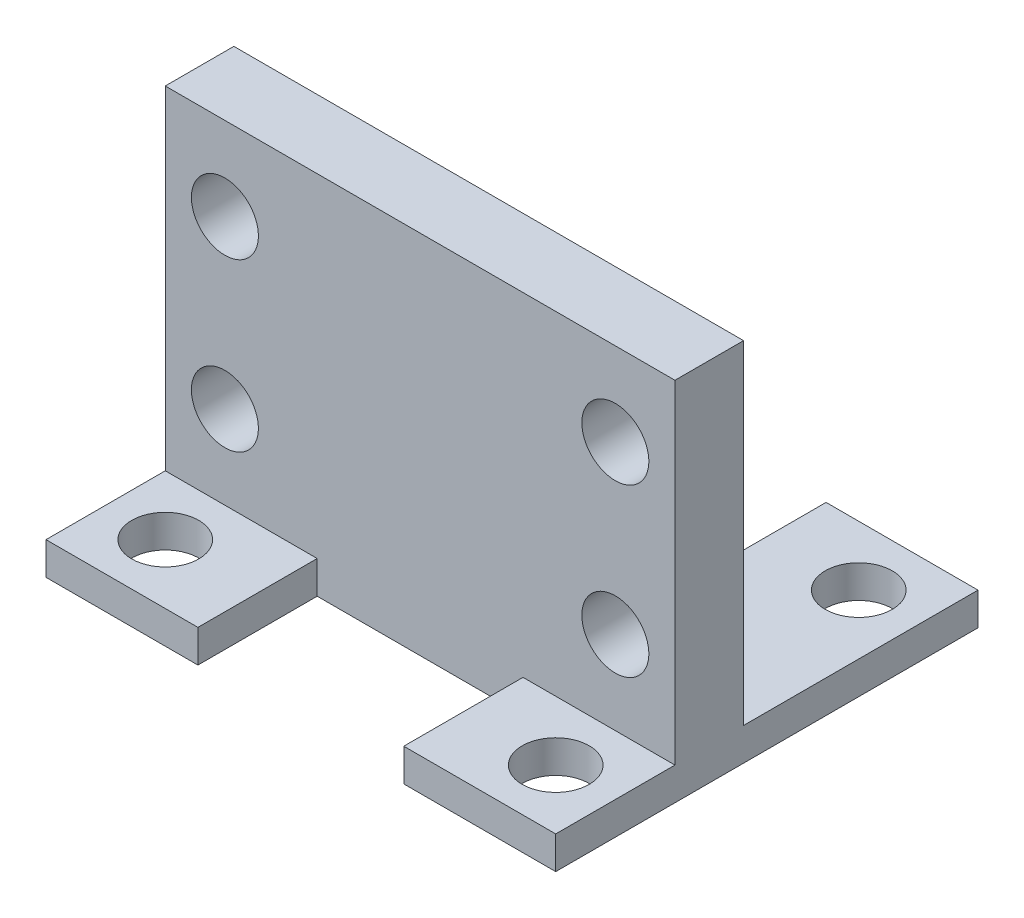
ISO-10303-21;
HEADER;
FILE_DESCRIPTION(('STEP AP214'),'2;1');
FILE_NAME('part.step','',(''),(''),'','','');
FILE_SCHEMA(('AUTOMOTIVE_DESIGN { 1 0 10303 214 1 1 1 1 }'));
ENDSEC;
DATA;
#1=APPLICATION_CONTEXT('core data for automotive mechanical design processes');
#2=APPLICATION_PROTOCOL_DEFINITION('international standard','automotive_design',2000,#1);
#3=PRODUCT_CONTEXT('',#1,'mechanical');
#4=PRODUCT('Part','Part','',(#3));
#5=PRODUCT_RELATED_PRODUCT_CATEGORY('part','',(#4));
#6=PRODUCT_DEFINITION_FORMATION('','',#4);
#7=PRODUCT_DEFINITION_CONTEXT('part definition',#1,'design');
#8=PRODUCT_DEFINITION('design','',#6,#7);
#9=PRODUCT_DEFINITION_SHAPE('','',#8);
#10=(LENGTH_UNIT() NAMED_UNIT(*) SI_UNIT(.MILLI.,.METRE.));
#11=(NAMED_UNIT(*) PLANE_ANGLE_UNIT() SI_UNIT($,.RADIAN.));
#12=(NAMED_UNIT(*) SI_UNIT($,.STERADIAN.) SOLID_ANGLE_UNIT());
#13=UNCERTAINTY_MEASURE_WITH_UNIT(LENGTH_MEASURE(1.E-05),#10,'distance_accuracy_value','');
#14=(GEOMETRIC_REPRESENTATION_CONTEXT(3) GLOBAL_UNCERTAINTY_ASSIGNED_CONTEXT((#13)) GLOBAL_UNIT_ASSIGNED_CONTEXT((#10,
#11,#12)) REPRESENTATION_CONTEXT('',''));
#15=CARTESIAN_POINT('',(0.,0.,0.));
#16=DIRECTION('',(0.,0.,1.));
#17=DIRECTION('',(1.,0.,0.));
#18=AXIS2_PLACEMENT_3D('',#15,#16,#17);
#19=CARTESIAN_POINT('',(0.,2.,0.));
#20=DIRECTION('',(0.,1.,0.));
#21=DIRECTION('',(0.,0.,1.));
#22=AXIS2_PLACEMENT_3D('',#19,#20,#21);
#23=PLANE('',#22);
#24=DIRECTION('',(-1.,0.,0.));
#25=VECTOR('',#24,1.);
#26=CARTESIAN_POINT('',(0.,2.,5.));
#27=LINE('',#26,#25);
#28=CARTESIAN_POINT('',(15.6,2.,5.));
#29=VERTEX_POINT('',#28);
#30=CARTESIAN_POINT('',(6.3,2.,5.));
#31=VERTEX_POINT('',#30);
#32=EDGE_CURVE('E153',#29,#31,#27,.T.);
#33=ORIENTED_EDGE('',*,*,#32,.F.);
#34=DIRECTION('',(0.,0.,1.));
#35=VECTOR('',#34,1.);
#36=CARTESIAN_POINT('',(15.6,2.,0.));
#37=LINE('',#36,#35);
#38=CARTESIAN_POINT('',(15.6,2.,-9.35));
#39=VERTEX_POINT('',#38);
#40=EDGE_CURVE('E137',#39,#29,#37,.T.);
#41=ORIENTED_EDGE('',*,*,#40,.F.);
#42=DIRECTION('',(1.,0.,0.));
#43=VECTOR('',#42,1.);
#44=CARTESIAN_POINT('',(0.,2.,-9.34999999999999));
#45=LINE('',#44,#43);
#46=CARTESIAN_POINT('',(6.29999999999999,2.,-9.35));
#47=VERTEX_POINT('',#46);
#48=EDGE_CURVE('E151',#47,#39,#45,.T.);
#49=ORIENTED_EDGE('',*,*,#48,.F.);
#50=DIRECTION('',(0.,0.,1.));
#51=VECTOR('',#50,1.);
#52=CARTESIAN_POINT('',(6.3,2.,0.));
#53=LINE('',#52,#51);
#54=EDGE_CURVE('E158',#47,#31,#53,.T.);
#55=ORIENTED_EDGE('',*,*,#54,.T.);
#56=EDGE_LOOP('',(#33,#41,#49,#55));
#57=FACE_BOUND('',#56,.T.);
#58=CARTESIAN_POINT('',(11.95,2.,-5.7));
#59=DIRECTION('',(0.,1.,0.));
#60=DIRECTION('',(0.,0.,1.));
#61=AXIS2_PLACEMENT_3D('',#58,#59,#60);
#62=CIRCLE('',#61,2.05);
#63=CARTESIAN_POINT('',(11.95,2.,-3.65));
#64=VERTEX_POINT('',#63);
#65=EDGE_CURVE('E168',#64,#64,#62,.F.);
#66=ORIENTED_EDGE('',*,*,#65,.T.);
#67=EDGE_LOOP('',(#66));
#68=FACE_BOUND('',#67,.T.);
#69=ADVANCED_FACE('F39',(#57,#68),#23,.T.);
#70=CARTESIAN_POINT('',(-6.3,2.,5.));
#71=VERTEX_POINT('',#70);
#72=CARTESIAN_POINT('',(-15.6,2.,5.));
#73=VERTEX_POINT('',#72);
#74=EDGE_CURVE('E267',#71,#73,#27,.T.);
#75=ORIENTED_EDGE('',*,*,#74,.F.);
#76=DIRECTION('',(0.,0.,1.));
#77=VECTOR('',#76,1.);
#78=CARTESIAN_POINT('',(-6.3,2.,0.));
#79=LINE('',#78,#77);
#80=CARTESIAN_POINT('',(-6.29999999999999,2.,-9.35));
#81=VERTEX_POINT('',#80);
#82=EDGE_CURVE('E160',#81,#71,#79,.T.);
#83=ORIENTED_EDGE('',*,*,#82,.F.);
#84=DIRECTION('',(-1.,0.,0.));
#85=VECTOR('',#84,1.);
#86=CARTESIAN_POINT('',(0.,2.,-9.34999999999999));
#87=LINE('',#86,#85);
#88=CARTESIAN_POINT('',(-15.6,2.,-9.35));
#89=VERTEX_POINT('',#88);
#90=EDGE_CURVE('E320',#81,#89,#87,.T.);
#91=ORIENTED_EDGE('',*,*,#90,.T.);
#92=DIRECTION('',(0.,0.,1.));
#93=VECTOR('',#92,1.);
#94=CARTESIAN_POINT('',(-15.6,2.,0.));
#95=LINE('',#94,#93);
#96=EDGE_CURVE('E114',#89,#73,#95,.T.);
#97=ORIENTED_EDGE('',*,*,#96,.T.);
#98=EDGE_LOOP('',(#75,#83,#91,#97));
#99=FACE_BOUND('',#98,.T.);
#100=CARTESIAN_POINT('',(-11.95,2.,-5.7));
#101=DIRECTION('',(0.,1.,0.));
#102=DIRECTION('',(0.,0.,1.));
#103=AXIS2_PLACEMENT_3D('',#100,#101,#102);
#104=CIRCLE('',#103,2.05);
#105=CARTESIAN_POINT('',(-11.95,2.,-3.65));
#106=VERTEX_POINT('',#105);
#107=EDGE_CURVE('E215',#106,#106,#104,.T.);
#108=ORIENTED_EDGE('',*,*,#107,.F.);
#109=EDGE_LOOP('',(#108));
#110=FACE_BOUND('',#109,.T.);
#111=ADVANCED_FACE('F318',(#99,#110),#23,.T.);
#112=DIRECTION('',(1.,0.,0.));
#113=VECTOR('',#112,1.);
#114=CARTESIAN_POINT('',(0.,2.,9.2));
#115=LINE('',#114,#113);
#116=CARTESIAN_POINT('',(-15.6,2.,9.2));
#117=VERTEX_POINT('',#116);
#118=CARTESIAN_POINT('',(-6.3,2.,9.2));
#119=VERTEX_POINT('',#118);
#120=EDGE_CURVE('E257',#117,#119,#115,.T.);
#121=ORIENTED_EDGE('',*,*,#120,.F.);
#122=CARTESIAN_POINT('',(-15.6,2.,16.5));
#123=VERTEX_POINT('',#122);
#124=EDGE_CURVE('E322',#117,#123,#95,.T.);
#125=ORIENTED_EDGE('',*,*,#124,.T.);
#126=DIRECTION('',(1.,0.,0.));
#127=VECTOR('',#126,1.);
#128=CARTESIAN_POINT('',(0.,2.,16.5));
#129=LINE('',#128,#127);
#130=CARTESIAN_POINT('',(-6.3,2.,16.5));
#131=VERTEX_POINT('',#130);
#132=EDGE_CURVE('E239',#123,#131,#129,.T.);
#133=ORIENTED_EDGE('',*,*,#132,.T.);
#134=DIRECTION('',(0.,0.,-1.));
#135=VECTOR('',#134,1.);
#136=CARTESIAN_POINT('',(-6.3,2.,0.));
#137=LINE('',#136,#135);
#138=EDGE_CURVE('E270',#131,#119,#137,.T.);
#139=ORIENTED_EDGE('',*,*,#138,.T.);
#140=EDGE_LOOP('',(#121,#125,#133,#139));
#141=FACE_BOUND('',#140,.T.);
#142=CARTESIAN_POINT('',(-11.95,2.,12.85));
#143=DIRECTION('',(0.,1.,0.));
#144=DIRECTION('',(0.,0.,1.));
#145=AXIS2_PLACEMENT_3D('',#142,#143,#144);
#146=CIRCLE('',#145,2.05);
#147=CARTESIAN_POINT('',(-11.95,2.,14.9));
#148=VERTEX_POINT('',#147);
#149=EDGE_CURVE('E165',#148,#148,#146,.T.);
#150=ORIENTED_EDGE('',*,*,#149,.F.);
#151=EDGE_LOOP('',(#150));
#152=FACE_BOUND('',#151,.T.);
#153=ADVANCED_FACE('F271',(#141,#152),#23,.T.);
#154=CARTESIAN_POINT('',(0.,2.,-9.34999999999999));
#155=DIRECTION('',(0.,0.,1.));
#156=DIRECTION('',(1.,0.,0.));
#157=AXIS2_PLACEMENT_3D('',#154,#155,#156);
#158=PLANE('',#157);
#159=DIRECTION('',(-1.,0.,0.));
#160=VECTOR('',#159,1.);
#161=CARTESIAN_POINT('',(0.,0.,-9.34999999999999));
#162=LINE('',#161,#160);
#163=CARTESIAN_POINT('',(-6.29999999999999,0.,-9.35));
#164=VERTEX_POINT('',#163);
#165=CARTESIAN_POINT('',(-15.6,0.,-9.35));
#166=VERTEX_POINT('',#165);
#167=EDGE_CURVE('E177',#164,#166,#162,.T.);
#168=ORIENTED_EDGE('',*,*,#167,.T.);
#169=DIRECTION('',(0.,-1.,0.));
#170=VECTOR('',#169,1.);
#171=CARTESIAN_POINT('',(-15.6,2.,-9.35));
#172=LINE('',#171,#170);
#173=EDGE_CURVE('E11',#89,#166,#172,.T.);
#174=ORIENTED_EDGE('',*,*,#173,.F.);
#175=ORIENTED_EDGE('',*,*,#90,.F.);
#176=DIRECTION('',(0.,-1.,0.));
#177=VECTOR('',#176,1.);
#178=CARTESIAN_POINT('',(-6.29999999999999,2.,-9.35));
#179=LINE('',#178,#177);
#180=EDGE_CURVE('E63',#81,#164,#179,.T.);
#181=ORIENTED_EDGE('',*,*,#180,.T.);
#182=EDGE_LOOP('',(#168,#174,#175,#181));
#183=FACE_BOUND('',#182,.T.);
#184=ADVANCED_FACE('F324',(#183),#158,.F.);
#185=CARTESIAN_POINT('',(-15.6,2.,0.));
#186=DIRECTION('',(1.,0.,0.));
#187=DIRECTION('',(0.,0.,-1.));
#188=AXIS2_PLACEMENT_3D('',#185,#186,#187);
#189=PLANE('',#188);
#190=ORIENTED_EDGE('',*,*,#124,.F.);
#191=DIRECTION('',(0.,-1.,0.));
#192=VECTOR('',#191,1.);
#193=CARTESIAN_POINT('',(-15.6,22.4,9.2));
#194=LINE('',#193,#192);
#195=CARTESIAN_POINT('',(-15.6,22.4,9.2));
#196=VERTEX_POINT('',#195);
#197=EDGE_CURVE('E262',#196,#117,#194,.T.);
#198=ORIENTED_EDGE('',*,*,#197,.F.);
#199=DIRECTION('',(0.,0.,1.));
#200=VECTOR('',#199,1.);
#201=CARTESIAN_POINT('',(-15.6,22.4,0.));
#202=LINE('',#201,#200);
#203=CARTESIAN_POINT('',(-15.6,22.4,5.));
#204=VERTEX_POINT('',#203);
#205=EDGE_CURVE('E1071',#204,#196,#202,.T.);
#206=ORIENTED_EDGE('',*,*,#205,.F.);
#207=DIRECTION('',(0.,-1.,0.));
#208=VECTOR('',#207,1.);
#209=CARTESIAN_POINT('',(-15.6,22.4,5.));
#210=LINE('',#209,#208);
#211=EDGE_CURVE('E1087',#204,#73,#210,.T.);
#212=ORIENTED_EDGE('',*,*,#211,.T.);
#213=ORIENTED_EDGE('',*,*,#96,.F.);
#214=ORIENTED_EDGE('',*,*,#173,.T.);
#215=DIRECTION('',(0.,0.,1.));
#216=VECTOR('',#215,1.);
#217=CARTESIAN_POINT('',(-15.6,0.,0.));
#218=LINE('',#217,#216);
#219=CARTESIAN_POINT('',(-15.6,0.,16.5));
#220=VERTEX_POINT('',#219);
#221=EDGE_CURVE('E179',#166,#220,#218,.T.);
#222=ORIENTED_EDGE('',*,*,#221,.T.);
#223=DIRECTION('',(0.,-1.,0.));
#224=VECTOR('',#223,1.);
#225=CARTESIAN_POINT('',(-15.6,2.,16.5));
#226=LINE('',#225,#224);
#227=EDGE_CURVE('E47',#123,#220,#226,.T.);
#228=ORIENTED_EDGE('',*,*,#227,.F.);
#229=EDGE_LOOP('',(#190,#198,#206,#212,#213,#214,#222,#228));
#230=FACE_BOUND('',#229,.T.);
#231=ADVANCED_FACE('F325',(#230),#189,.F.);
#232=CARTESIAN_POINT('',(0.,2.,16.5));
#233=DIRECTION('',(0.,0.,-1.));
#234=DIRECTION('',(-1.,0.,0.));
#235=AXIS2_PLACEMENT_3D('',#232,#233,#234);
#236=PLANE('',#235);
#237=DIRECTION('',(1.,0.,0.));
#238=VECTOR('',#237,1.);
#239=CARTESIAN_POINT('',(0.,0.,16.5));
#240=LINE('',#239,#238);
#241=CARTESIAN_POINT('',(-6.3,0.,16.5));
#242=VERTEX_POINT('',#241);
#243=EDGE_CURVE('E181',#220,#242,#240,.T.);
#244=ORIENTED_EDGE('',*,*,#243,.T.);
#245=DIRECTION('',(0.,-1.,0.));
#246=VECTOR('',#245,1.);
#247=CARTESIAN_POINT('',(-6.3,2.,16.5));
#248=LINE('',#247,#246);
#249=EDGE_CURVE('E230',#131,#242,#248,.T.);
#250=ORIENTED_EDGE('',*,*,#249,.F.);
#251=ORIENTED_EDGE('',*,*,#132,.F.);
#252=ORIENTED_EDGE('',*,*,#227,.T.);
#253=EDGE_LOOP('',(#244,#250,#251,#252));
#254=FACE_BOUND('',#253,.T.);
#255=ADVANCED_FACE('F237',(#254),#236,.F.);
#256=CARTESIAN_POINT('',(-6.3,2.,0.));
#257=DIRECTION('',(-1.,0.,0.));
#258=DIRECTION('',(0.,0.,1.));
#259=AXIS2_PLACEMENT_3D('',#256,#257,#258);
#260=PLANE('',#259);
#261=DIRECTION('',(0.,0.,-1.));
#262=VECTOR('',#261,1.);
#263=CARTESIAN_POINT('',(-6.3,0.,0.));
#264=LINE('',#263,#262);
#265=CARTESIAN_POINT('',(-6.3,0.,9.2));
#266=VERTEX_POINT('',#265);
#267=EDGE_CURVE('E183',#242,#266,#264,.T.);
#268=ORIENTED_EDGE('',*,*,#267,.T.);
#269=DIRECTION('',(0.,-1.,0.));
#270=VECTOR('',#269,1.);
#271=CARTESIAN_POINT('',(-6.3,2.,9.2));
#272=LINE('',#271,#270);
#273=EDGE_CURVE('E227',#119,#266,#272,.T.);
#274=ORIENTED_EDGE('',*,*,#273,.F.);
#275=ORIENTED_EDGE('',*,*,#138,.F.);
#276=ORIENTED_EDGE('',*,*,#249,.T.);
#277=EDGE_LOOP('',(#268,#274,#275,#276));
#278=FACE_BOUND('',#277,.T.);
#279=ADVANCED_FACE('F248',(#278),#260,.F.);
#280=CARTESIAN_POINT('',(0.,2.,9.2));
#281=DIRECTION('',(0.,0.,-1.));
#282=DIRECTION('',(-1.,0.,0.));
#283=AXIS2_PLACEMENT_3D('',#280,#281,#282);
#284=PLANE('',#283);
#285=CARTESIAN_POINT('',(11.95,17.3,9.2));
#286=DIRECTION('',(0.,0.,-1.));
#287=DIRECTION('',(-1.,0.,0.));
#288=AXIS2_PLACEMENT_3D('',#285,#286,#287);
#289=CIRCLE('',#288,2.05);
#290=CARTESIAN_POINT('',(9.9,17.3,9.2));
#291=VERTEX_POINT('',#290);
#292=EDGE_CURVE('E1067',#291,#291,#289,.T.);
#293=ORIENTED_EDGE('',*,*,#292,.T.);
#294=EDGE_LOOP('',(#293));
#295=FACE_BOUND('',#294,.T.);
#296=CARTESIAN_POINT('',(-11.95,7.1,9.2));
#297=DIRECTION('',(0.,0.,-1.));
#298=DIRECTION('',(-1.,0.,0.));
#299=AXIS2_PLACEMENT_3D('',#296,#297,#298);
#300=CIRCLE('',#299,2.05);
#301=CARTESIAN_POINT('',(-14.,7.1,9.2));
#302=VERTEX_POINT('',#301);
#303=EDGE_CURVE('E1069',#302,#302,#300,.T.);
#304=ORIENTED_EDGE('',*,*,#303,.T.);
#305=EDGE_LOOP('',(#304));
#306=FACE_BOUND('',#305,.T.);
#307=CARTESIAN_POINT('',(-11.95,17.3,9.2));
#308=DIRECTION('',(0.,0.,-1.));
#309=DIRECTION('',(-1.,0.,0.));
#310=AXIS2_PLACEMENT_3D('',#307,#308,#309);
#311=CIRCLE('',#310,2.05000000000001);
#312=CARTESIAN_POINT('',(-14.,17.3,9.2));
#313=VERTEX_POINT('',#312);
#314=EDGE_CURVE('E1074',#313,#313,#311,.T.);
#315=ORIENTED_EDGE('',*,*,#314,.T.);
#316=EDGE_LOOP('',(#315));
#317=FACE_BOUND('',#316,.T.);
#318=CARTESIAN_POINT('',(11.95,7.1,9.2));
#319=DIRECTION('',(0.,0.,-1.));
#320=DIRECTION('',(-1.,0.,0.));
#321=AXIS2_PLACEMENT_3D('',#318,#319,#320);
#322=CIRCLE('',#321,2.05);
#323=CARTESIAN_POINT('',(9.90000000000001,7.1,9.2));
#324=VERTEX_POINT('',#323);
#325=EDGE_CURVE('E1111',#324,#324,#322,.T.);
#326=ORIENTED_EDGE('',*,*,#325,.T.);
#327=EDGE_LOOP('',(#326));
#328=FACE_BOUND('',#327,.T.);
#329=DIRECTION('',(1.,0.,0.));
#330=VECTOR('',#329,1.);
#331=CARTESIAN_POINT('',(0.,0.,9.2));
#332=LINE('',#331,#330);
#333=CARTESIAN_POINT('',(6.3,0.,9.2));
#334=VERTEX_POINT('',#333);
#335=EDGE_CURVE('E185',#266,#334,#332,.T.);
#336=ORIENTED_EDGE('',*,*,#335,.T.);
#337=DIRECTION('',(0.,-1.,0.));
#338=VECTOR('',#337,1.);
#339=CARTESIAN_POINT('',(6.3,2.,9.2));
#340=LINE('',#339,#338);
#341=CARTESIAN_POINT('',(6.3,2.,9.2));
#342=VERTEX_POINT('',#341);
#343=EDGE_CURVE('E225',#342,#334,#340,.T.);
#344=ORIENTED_EDGE('',*,*,#343,.F.);
#345=CARTESIAN_POINT('',(15.6,2.,9.2));
#346=VERTEX_POINT('',#345);
#347=EDGE_CURVE('E268',#342,#346,#115,.T.);
#348=ORIENTED_EDGE('',*,*,#347,.T.);
#349=DIRECTION('',(0.,-1.,0.));
#350=VECTOR('',#349,1.);
#351=CARTESIAN_POINT('',(15.6,22.4,9.2));
#352=LINE('',#351,#350);
#353=CARTESIAN_POINT('',(15.6,22.4,9.2));
#354=VERTEX_POINT('',#353);
#355=EDGE_CURVE('E54',#354,#346,#352,.T.);
#356=ORIENTED_EDGE('',*,*,#355,.F.);
#357=DIRECTION('',(-1.,0.,0.));
#358=VECTOR('',#357,1.);
#359=CARTESIAN_POINT('',(0.,22.4,9.2));
#360=LINE('',#359,#358);
#361=EDGE_CURVE('E1080',#354,#196,#360,.T.);
#362=ORIENTED_EDGE('',*,*,#361,.T.);
#363=ORIENTED_EDGE('',*,*,#197,.T.);
#364=ORIENTED_EDGE('',*,*,#120,.T.);
#365=ORIENTED_EDGE('',*,*,#273,.T.);
#366=EDGE_LOOP('',(#336,#344,#348,#356,#362,#363,#364,#365));
#367=FACE_BOUND('',#366,.T.);
#368=ADVANCED_FACE('F253',(#295,#306,#317,#328,#367),#284,.F.);
#369=CARTESIAN_POINT('',(6.3,2.,0.));
#370=DIRECTION('',(-1.,0.,0.));
#371=DIRECTION('',(0.,0.,1.));
#372=AXIS2_PLACEMENT_3D('',#369,#370,#371);
#373=PLANE('',#372);
#374=DIRECTION('',(0.,0.,-1.));
#375=VECTOR('',#374,1.);
#376=CARTESIAN_POINT('',(6.3,0.,0.));
#377=LINE('',#376,#375);
#378=CARTESIAN_POINT('',(6.3,0.,16.5));
#379=VERTEX_POINT('',#378);
#380=EDGE_CURVE('E188',#379,#334,#377,.T.);
#381=ORIENTED_EDGE('',*,*,#380,.F.);
#382=DIRECTION('',(0.,-1.,0.));
#383=VECTOR('',#382,1.);
#384=CARTESIAN_POINT('',(6.3,2.,16.5));
#385=LINE('',#384,#383);
#386=CARTESIAN_POINT('',(6.3,2.,16.5));
#387=VERTEX_POINT('',#386);
#388=EDGE_CURVE('E223',#387,#379,#385,.T.);
#389=ORIENTED_EDGE('',*,*,#388,.F.);
#390=DIRECTION('',(0.,0.,-1.));
#391=VECTOR('',#390,1.);
#392=CARTESIAN_POINT('',(6.3,2.,0.));
#393=LINE('',#392,#391);
#394=EDGE_CURVE('E273',#387,#342,#393,.T.);
#395=ORIENTED_EDGE('',*,*,#394,.T.);
#396=ORIENTED_EDGE('',*,*,#343,.T.);
#397=EDGE_LOOP('',(#381,#389,#395,#396));
#398=FACE_BOUND('',#397,.T.);
#399=ADVANCED_FACE('F294',(#398),#373,.T.);
#400=CARTESIAN_POINT('',(0.,2.,16.5));
#401=DIRECTION('',(0.,0.,1.));
#402=DIRECTION('',(1.,0.,0.));
#403=AXIS2_PLACEMENT_3D('',#400,#401,#402);
#404=PLANE('',#403);
#405=DIRECTION('',(-1.,0.,0.));
#406=VECTOR('',#405,1.);
#407=CARTESIAN_POINT('',(0.,0.,16.5));
#408=LINE('',#407,#406);
#409=CARTESIAN_POINT('',(15.6,0.,16.5));
#410=VERTEX_POINT('',#409);
#411=EDGE_CURVE('E191',#410,#379,#408,.T.);
#412=ORIENTED_EDGE('',*,*,#411,.F.);
#413=DIRECTION('',(0.,-1.,0.));
#414=VECTOR('',#413,1.);
#415=CARTESIAN_POINT('',(15.6,2.,16.5));
#416=LINE('',#415,#414);
#417=CARTESIAN_POINT('',(15.6,2.,16.5));
#418=VERTEX_POINT('',#417);
#419=EDGE_CURVE('E143',#418,#410,#416,.T.);
#420=ORIENTED_EDGE('',*,*,#419,.F.);
#421=DIRECTION('',(-1.,0.,0.));
#422=VECTOR('',#421,1.);
#423=CARTESIAN_POINT('',(0.,2.,16.5));
#424=LINE('',#423,#422);
#425=EDGE_CURVE('E276',#418,#387,#424,.T.);
#426=ORIENTED_EDGE('',*,*,#425,.T.);
#427=ORIENTED_EDGE('',*,*,#388,.T.);
#428=EDGE_LOOP('',(#412,#420,#426,#427));
#429=FACE_BOUND('',#428,.T.);
#430=ADVANCED_FACE('F288',(#429),#404,.T.);
#431=CARTESIAN_POINT('',(15.6,2.,0.));
#432=DIRECTION('',(1.,0.,0.));
#433=DIRECTION('',(0.,0.,-1.));
#434=AXIS2_PLACEMENT_3D('',#431,#432,#433);
#435=PLANE('',#434);
#436=ORIENTED_EDGE('',*,*,#419,.T.);
#437=DIRECTION('',(0.,0.,1.));
#438=VECTOR('',#437,1.);
#439=CARTESIAN_POINT('',(15.6,0.,0.));
#440=LINE('',#439,#438);
#441=CARTESIAN_POINT('',(15.6,0.,-9.35));
#442=VERTEX_POINT('',#441);
#443=EDGE_CURVE('E138',#442,#410,#440,.T.);
#444=ORIENTED_EDGE('',*,*,#443,.F.);
#445=DIRECTION('',(0.,-1.,0.));
#446=VECTOR('',#445,1.);
#447=CARTESIAN_POINT('',(15.6,2.,-9.35));
#448=LINE('',#447,#446);
#449=EDGE_CURVE('E131',#39,#442,#448,.T.);
#450=ORIENTED_EDGE('',*,*,#449,.F.);
#451=ORIENTED_EDGE('',*,*,#40,.T.);
#452=DIRECTION('',(0.,-1.,0.));
#453=VECTOR('',#452,1.);
#454=CARTESIAN_POINT('',(15.6,22.4,5.));
#455=LINE('',#454,#453);
#456=CARTESIAN_POINT('',(15.6,22.4,5.));
#457=VERTEX_POINT('',#456);
#458=EDGE_CURVE('E311',#457,#29,#455,.T.);
#459=ORIENTED_EDGE('',*,*,#458,.F.);
#460=DIRECTION('',(0.,0.,1.));
#461=VECTOR('',#460,1.);
#462=CARTESIAN_POINT('',(15.6,22.4,0.));
#463=LINE('',#462,#461);
#464=EDGE_CURVE('E1082',#457,#354,#463,.T.);
#465=ORIENTED_EDGE('',*,*,#464,.T.);
#466=ORIENTED_EDGE('',*,*,#355,.T.);
#467=EDGE_CURVE('E154',#346,#418,#37,.T.);
#468=ORIENTED_EDGE('',*,*,#467,.T.);
#469=EDGE_LOOP('',(#436,#444,#450,#451,#459,#465,#466,#468));
#470=FACE_BOUND('',#469,.T.);
#471=ADVANCED_FACE('F134',(#470),#435,.T.);
#472=CARTESIAN_POINT('',(0.,2.,-9.34999999999999));
#473=DIRECTION('',(0.,0.,-1.));
#474=DIRECTION('',(-1.,0.,0.));
#475=AXIS2_PLACEMENT_3D('',#472,#473,#474);
#476=PLANE('',#475);
#477=DIRECTION('',(1.,0.,0.));
#478=VECTOR('',#477,1.);
#479=CARTESIAN_POINT('',(0.,0.,-9.34999999999999));
#480=LINE('',#479,#478);
#481=CARTESIAN_POINT('',(6.29999999999999,0.,-9.35));
#482=VERTEX_POINT('',#481);
#483=EDGE_CURVE('E195',#482,#442,#480,.T.);
#484=ORIENTED_EDGE('',*,*,#483,.F.);
#485=DIRECTION('',(0.,-1.,0.));
#486=VECTOR('',#485,1.);
#487=CARTESIAN_POINT('',(6.29999999999999,2.,-9.35));
#488=LINE('',#487,#486);
#489=EDGE_CURVE('E144',#47,#482,#488,.T.);
#490=ORIENTED_EDGE('',*,*,#489,.F.);
#491=ORIENTED_EDGE('',*,*,#48,.T.);
#492=ORIENTED_EDGE('',*,*,#449,.T.);
#493=EDGE_LOOP('',(#484,#490,#491,#492));
#494=FACE_BOUND('',#493,.T.);
#495=ADVANCED_FACE('F156',(#494),#476,.T.);
#496=CARTESIAN_POINT('',(6.3,2.,0.));
#497=DIRECTION('',(1.,0.,0.));
#498=DIRECTION('',(0.,0.,-1.));
#499=AXIS2_PLACEMENT_3D('',#496,#497,#498);
#500=PLANE('',#499);
#501=DIRECTION('',(0.,0.,1.));
#502=VECTOR('',#501,1.);
#503=CARTESIAN_POINT('',(6.3,0.,0.));
#504=LINE('',#503,#502);
#505=CARTESIAN_POINT('',(6.3,0.,5.));
#506=VERTEX_POINT('',#505);
#507=EDGE_CURVE('E197',#482,#506,#504,.T.);
#508=ORIENTED_EDGE('',*,*,#507,.T.);
#509=DIRECTION('',(0.,-1.,0.));
#510=VECTOR('',#509,1.);
#511=CARTESIAN_POINT('',(6.3,2.,5.));
#512=LINE('',#511,#510);
#513=EDGE_CURVE('E219',#31,#506,#512,.T.);
#514=ORIENTED_EDGE('',*,*,#513,.F.);
#515=ORIENTED_EDGE('',*,*,#54,.F.);
#516=ORIENTED_EDGE('',*,*,#489,.T.);
#517=EDGE_LOOP('',(#508,#514,#515,#516));
#518=FACE_BOUND('',#517,.T.);
#519=ADVANCED_FACE('F314',(#518),#500,.F.);
#520=CARTESIAN_POINT('',(0.,2.,5.));
#521=DIRECTION('',(0.,0.,-1.));
#522=DIRECTION('',(-1.,0.,0.));
#523=AXIS2_PLACEMENT_3D('',#520,#521,#522);
#524=PLANE('',#523);
#525=CARTESIAN_POINT('',(11.95,17.3,5.));
#526=DIRECTION('',(0.,0.,-1.));
#527=DIRECTION('',(1.,0.,0.));
#528=AXIS2_PLACEMENT_3D('',#525,#526,#527);
#529=CIRCLE('',#528,2.05);
#530=CARTESIAN_POINT('',(14.,17.3,5.));
#531=VERTEX_POINT('',#530);
#532=EDGE_CURVE('E1064',#531,#531,#529,.T.);
#533=ORIENTED_EDGE('',*,*,#532,.F.);
#534=EDGE_LOOP('',(#533));
#535=FACE_BOUND('',#534,.T.);
#536=CARTESIAN_POINT('',(-11.95,7.1,5.));
#537=DIRECTION('',(0.,0.,-1.));
#538=DIRECTION('',(1.,0.,0.));
#539=AXIS2_PLACEMENT_3D('',#536,#537,#538);
#540=CIRCLE('',#539,2.05);
#541=CARTESIAN_POINT('',(-9.9,7.1,5.));
#542=VERTEX_POINT('',#541);
#543=EDGE_CURVE('E1117',#542,#542,#540,.T.);
#544=ORIENTED_EDGE('',*,*,#543,.F.);
#545=EDGE_LOOP('',(#544));
#546=FACE_BOUND('',#545,.T.);
#547=CARTESIAN_POINT('',(-11.95,17.3,5.));
#548=DIRECTION('',(0.,0.,-1.));
#549=DIRECTION('',(-1.,0.,0.));
#550=AXIS2_PLACEMENT_3D('',#547,#548,#549);
#551=CIRCLE('',#550,2.05000000000001);
#552=CARTESIAN_POINT('',(-14.,17.3,5.));
#553=VERTEX_POINT('',#552);
#554=EDGE_CURVE('E1120',#553,#553,#551,.T.);
#555=ORIENTED_EDGE('',*,*,#554,.F.);
#556=EDGE_LOOP('',(#555));
#557=FACE_BOUND('',#556,.T.);
#558=CARTESIAN_POINT('',(11.95,7.1,5.));
#559=DIRECTION('',(0.,0.,-1.));
#560=DIRECTION('',(-1.,0.,0.));
#561=AXIS2_PLACEMENT_3D('',#558,#559,#560);
#562=CIRCLE('',#561,2.05);
#563=CARTESIAN_POINT('',(9.9,7.1,5.));
#564=VERTEX_POINT('',#563);
#565=EDGE_CURVE('E1114',#564,#564,#562,.T.);
#566=ORIENTED_EDGE('',*,*,#565,.F.);
#567=EDGE_LOOP('',(#566));
#568=FACE_BOUND('',#567,.T.);
#569=DIRECTION('',(1.,0.,0.));
#570=VECTOR('',#569,1.);
#571=CARTESIAN_POINT('',(0.,0.,5.));
#572=LINE('',#571,#570);
#573=CARTESIAN_POINT('',(-6.3,0.,5.));
#574=VERTEX_POINT('',#573);
#575=EDGE_CURVE('E200',#574,#506,#572,.T.);
#576=ORIENTED_EDGE('',*,*,#575,.F.);
#577=DIRECTION('',(0.,-1.,0.));
#578=VECTOR('',#577,1.);
#579=CARTESIAN_POINT('',(-6.3,2.,5.));
#580=LINE('',#579,#578);
#581=EDGE_CURVE('E217',#71,#574,#580,.T.);
#582=ORIENTED_EDGE('',*,*,#581,.F.);
#583=ORIENTED_EDGE('',*,*,#74,.T.);
#584=ORIENTED_EDGE('',*,*,#211,.F.);
#585=DIRECTION('',(1.,0.,0.));
#586=VECTOR('',#585,1.);
#587=CARTESIAN_POINT('',(0.,22.4,5.));
#588=LINE('',#587,#586);
#589=EDGE_CURVE('E1068',#204,#457,#588,.T.);
#590=ORIENTED_EDGE('',*,*,#589,.T.);
#591=ORIENTED_EDGE('',*,*,#458,.T.);
#592=ORIENTED_EDGE('',*,*,#32,.T.);
#593=ORIENTED_EDGE('',*,*,#513,.T.);
#594=EDGE_LOOP('',(#576,#582,#583,#584,#590,#591,#592,#593));
#595=FACE_BOUND('',#594,.T.);
#596=ADVANCED_FACE('F308',(#535,#546,#557,#568,#595),#524,.T.);
#597=CARTESIAN_POINT('',(11.95,2.,-5.7));
#598=DIRECTION('',(0.,-1.,0.));
#599=DIRECTION('',(0.,0.,-1.));
#600=AXIS2_PLACEMENT_3D('',#597,#598,#599);
#601=CYLINDRICAL_SURFACE('',#600,2.05);
#602=ORIENTED_EDGE('',*,*,#65,.F.);
#603=EDGE_LOOP('',(#602));
#604=FACE_BOUND('',#603,.T.);
#605=CARTESIAN_POINT('',(11.95,0.,-5.7));
#606=DIRECTION('',(0.,1.,0.));
#607=DIRECTION('',(0.,0.,1.));
#608=AXIS2_PLACEMENT_3D('',#605,#606,#607);
#609=CIRCLE('',#608,2.05);
#610=CARTESIAN_POINT('',(11.95,0.,-3.65));
#611=VERTEX_POINT('',#610);
#612=EDGE_CURVE('E209',#611,#611,#609,.F.);
#613=ORIENTED_EDGE('',*,*,#612,.T.);
#614=EDGE_LOOP('',(#613));
#615=FACE_BOUND('',#614,.T.);
#616=ADVANCED_FACE('F397',(#604,#615),#601,.F.);
#617=CARTESIAN_POINT('',(-11.95,2.,12.85));
#618=DIRECTION('',(0.,-1.,0.));
#619=DIRECTION('',(0.,0.,-1.));
#620=AXIS2_PLACEMENT_3D('',#617,#618,#619);
#621=CYLINDRICAL_SURFACE('',#620,2.05);
#622=ORIENTED_EDGE('',*,*,#149,.T.);
#623=EDGE_LOOP('',(#622));
#624=FACE_BOUND('',#623,.T.);
#625=CARTESIAN_POINT('',(-11.95,0.,12.85));
#626=DIRECTION('',(0.,1.,0.));
#627=DIRECTION('',(0.,0.,1.));
#628=AXIS2_PLACEMENT_3D('',#625,#626,#627);
#629=CIRCLE('',#628,2.05);
#630=CARTESIAN_POINT('',(-11.95,0.,14.9));
#631=VERTEX_POINT('',#630);
#632=EDGE_CURVE('E206',#631,#631,#629,.T.);
#633=ORIENTED_EDGE('',*,*,#632,.F.);
#634=EDGE_LOOP('',(#633));
#635=FACE_BOUND('',#634,.T.);
#636=ADVANCED_FACE('F402',(#624,#635),#621,.F.);
#637=CARTESIAN_POINT('',(-6.3,2.,0.));
#638=DIRECTION('',(1.,0.,0.));
#639=DIRECTION('',(0.,0.,-1.));
#640=AXIS2_PLACEMENT_3D('',#637,#638,#639);
#641=PLANE('',#640);
#642=DIRECTION('',(0.,0.,1.));
#643=VECTOR('',#642,1.);
#644=CARTESIAN_POINT('',(-6.3,0.,0.));
#645=LINE('',#644,#643);
#646=EDGE_CURVE('E203',#164,#574,#645,.T.);
#647=ORIENTED_EDGE('',*,*,#646,.F.);
#648=ORIENTED_EDGE('',*,*,#180,.F.);
#649=ORIENTED_EDGE('',*,*,#82,.T.);
#650=ORIENTED_EDGE('',*,*,#581,.T.);
#651=EDGE_LOOP('',(#647,#648,#649,#650));
#652=FACE_BOUND('',#651,.T.);
#653=ADVANCED_FACE('F317',(#652),#641,.T.);
#654=CARTESIAN_POINT('',(-11.95,2.,-5.7));
#655=DIRECTION('',(0.,-1.,0.));
#656=DIRECTION('',(0.,0.,-1.));
#657=AXIS2_PLACEMENT_3D('',#654,#655,#656);
#658=CYLINDRICAL_SURFACE('',#657,2.05);
#659=ORIENTED_EDGE('',*,*,#107,.T.);
#660=EDGE_LOOP('',(#659));
#661=FACE_BOUND('',#660,.T.);
#662=CARTESIAN_POINT('',(-11.95,0.,-5.7));
#663=DIRECTION('',(0.,1.,0.));
#664=DIRECTION('',(0.,0.,1.));
#665=AXIS2_PLACEMENT_3D('',#662,#663,#664);
#666=CIRCLE('',#665,2.05);
#667=CARTESIAN_POINT('',(-11.95,0.,-3.65));
#668=VERTEX_POINT('',#667);
#669=EDGE_CURVE('E174',#668,#668,#666,.T.);
#670=ORIENTED_EDGE('',*,*,#669,.F.);
#671=EDGE_LOOP('',(#670));
#672=FACE_BOUND('',#671,.T.);
#673=ADVANCED_FACE('F41',(#661,#672),#658,.F.);
#674=CARTESIAN_POINT('',(11.95,2.,12.85));
#675=DIRECTION('',(0.,-1.,0.));
#676=DIRECTION('',(0.,0.,-1.));
#677=AXIS2_PLACEMENT_3D('',#674,#675,#676);
#678=CYLINDRICAL_SURFACE('',#677,2.05);
#679=CARTESIAN_POINT('',(11.95,2.,12.85));
#680=DIRECTION('',(0.,1.,0.));
#681=DIRECTION('',(0.,0.,1.));
#682=AXIS2_PLACEMENT_3D('',#679,#680,#681);
#683=CIRCLE('',#682,2.05);
#684=CARTESIAN_POINT('',(11.95,2.,14.9));
#685=VERTEX_POINT('',#684);
#686=EDGE_CURVE('E171',#685,#685,#683,.F.);
#687=ORIENTED_EDGE('',*,*,#686,.F.);
#688=EDGE_LOOP('',(#687));
#689=FACE_BOUND('',#688,.T.);
#690=CARTESIAN_POINT('',(11.95,0.,12.85));
#691=DIRECTION('',(0.,1.,0.));
#692=DIRECTION('',(0.,0.,1.));
#693=AXIS2_PLACEMENT_3D('',#690,#691,#692);
#694=CIRCLE('',#693,2.05);
#695=CARTESIAN_POINT('',(11.95,0.,14.9));
#696=VERTEX_POINT('',#695);
#697=EDGE_CURVE('E212',#696,#696,#694,.F.);
#698=ORIENTED_EDGE('',*,*,#697,.T.);
#699=EDGE_LOOP('',(#698));
#700=FACE_BOUND('',#699,.T.);
#701=ADVANCED_FACE('F341',(#689,#700),#678,.F.);
#702=ORIENTED_EDGE('',*,*,#347,.F.);
#703=ORIENTED_EDGE('',*,*,#394,.F.);
#704=ORIENTED_EDGE('',*,*,#425,.F.);
#705=ORIENTED_EDGE('',*,*,#467,.F.);
#706=EDGE_LOOP('',(#702,#703,#704,#705));
#707=FACE_BOUND('',#706,.T.);
#708=ORIENTED_EDGE('',*,*,#686,.T.);
#709=EDGE_LOOP('',(#708));
#710=FACE_BOUND('',#709,.T.);
#711=ADVANCED_FACE('F290',(#707,#710),#23,.T.);
#712=CARTESIAN_POINT('',(0.,0.,0.));
#713=DIRECTION('',(0.,1.,0.));
#714=DIRECTION('',(0.,0.,1.));
#715=AXIS2_PLACEMENT_3D('',#712,#713,#714);
#716=PLANE('',#715);
#717=ORIENTED_EDGE('',*,*,#380,.T.);
#718=ORIENTED_EDGE('',*,*,#335,.F.);
#719=ORIENTED_EDGE('',*,*,#267,.F.);
#720=ORIENTED_EDGE('',*,*,#243,.F.);
#721=ORIENTED_EDGE('',*,*,#221,.F.);
#722=ORIENTED_EDGE('',*,*,#167,.F.);
#723=ORIENTED_EDGE('',*,*,#646,.T.);
#724=ORIENTED_EDGE('',*,*,#575,.T.);
#725=ORIENTED_EDGE('',*,*,#507,.F.);
#726=ORIENTED_EDGE('',*,*,#483,.T.);
#727=ORIENTED_EDGE('',*,*,#443,.T.);
#728=ORIENTED_EDGE('',*,*,#411,.T.);
#729=EDGE_LOOP('',(#717,#718,#719,#720,#721,#722,#723,#724,#725,#726,#727,#728));
#730=FACE_BOUND('',#729,.T.);
#731=ORIENTED_EDGE('',*,*,#697,.F.);
#732=EDGE_LOOP('',(#731));
#733=FACE_BOUND('',#732,.T.);
#734=ORIENTED_EDGE('',*,*,#632,.T.);
#735=EDGE_LOOP('',(#734));
#736=FACE_BOUND('',#735,.T.);
#737=ORIENTED_EDGE('',*,*,#669,.T.);
#738=EDGE_LOOP('',(#737));
#739=FACE_BOUND('',#738,.T.);
#740=ORIENTED_EDGE('',*,*,#612,.F.);
#741=EDGE_LOOP('',(#740));
#742=FACE_BOUND('',#741,.T.);
#743=ADVANCED_FACE('F243',(#730,#733,#736,#739,#742),#716,.F.);
#744=CARTESIAN_POINT('',(0.,22.4,0.));
#745=DIRECTION('',(0.,1.,0.));
#746=DIRECTION('',(0.,0.,1.));
#747=AXIS2_PLACEMENT_3D('',#744,#745,#746);
#748=PLANE('',#747);
#749=ORIENTED_EDGE('',*,*,#589,.F.);
#750=ORIENTED_EDGE('',*,*,#205,.T.);
#751=ORIENTED_EDGE('',*,*,#361,.F.);
#752=ORIENTED_EDGE('',*,*,#464,.F.);
#753=EDGE_LOOP('',(#749,#750,#751,#752));
#754=FACE_BOUND('',#753,.T.);
#755=ADVANCED_FACE('F346',(#754),#748,.T.);
#756=CARTESIAN_POINT('',(11.95,7.1,16.5));
#757=DIRECTION('',(0.,0.,-1.));
#758=DIRECTION('',(-1.,0.,0.));
#759=AXIS2_PLACEMENT_3D('',#756,#757,#758);
#760=CYLINDRICAL_SURFACE('',#759,2.05);
#761=ORIENTED_EDGE('',*,*,#565,.T.);
#762=EDGE_LOOP('',(#761));
#763=FACE_BOUND('',#762,.T.);
#764=ORIENTED_EDGE('',*,*,#325,.F.);
#765=EDGE_LOOP('',(#764));
#766=FACE_BOUND('',#765,.T.);
#767=ADVANCED_FACE('F598',(#763,#766),#760,.F.);
#768=CARTESIAN_POINT('',(-11.95,17.3,16.5));
#769=DIRECTION('',(0.,0.,-1.));
#770=DIRECTION('',(-1.,0.,0.));
#771=AXIS2_PLACEMENT_3D('',#768,#769,#770);
#772=CYLINDRICAL_SURFACE('',#771,2.05000000000001);
#773=ORIENTED_EDGE('',*,*,#554,.T.);
#774=EDGE_LOOP('',(#773));
#775=FACE_BOUND('',#774,.T.);
#776=ORIENTED_EDGE('',*,*,#314,.F.);
#777=EDGE_LOOP('',(#776));
#778=FACE_BOUND('',#777,.T.);
#779=ADVANCED_FACE('F641',(#775,#778),#772,.F.);
#780=CARTESIAN_POINT('',(-11.95,7.1,16.5));
#781=DIRECTION('',(0.,0.,-1.));
#782=DIRECTION('',(-1.,0.,0.));
#783=AXIS2_PLACEMENT_3D('',#780,#781,#782);
#784=CYLINDRICAL_SURFACE('',#783,2.05);
#785=ORIENTED_EDGE('',*,*,#543,.T.);
#786=EDGE_LOOP('',(#785));
#787=FACE_BOUND('',#786,.T.);
#788=ORIENTED_EDGE('',*,*,#303,.F.);
#789=EDGE_LOOP('',(#788));
#790=FACE_BOUND('',#789,.T.);
#791=ADVANCED_FACE('F652',(#787,#790),#784,.F.);
#792=CARTESIAN_POINT('',(11.95,17.3,16.5));
#793=DIRECTION('',(0.,0.,-1.));
#794=DIRECTION('',(-1.,0.,0.));
#795=AXIS2_PLACEMENT_3D('',#792,#793,#794);
#796=CYLINDRICAL_SURFACE('',#795,2.05);
#797=ORIENTED_EDGE('',*,*,#532,.T.);
#798=EDGE_LOOP('',(#797));
#799=FACE_BOUND('',#798,.T.);
#800=ORIENTED_EDGE('',*,*,#292,.F.);
#801=EDGE_LOOP('',(#800));
#802=FACE_BOUND('',#801,.T.);
#803=ADVANCED_FACE('F663',(#799,#802),#796,.F.);
#804=CLOSED_SHELL('',(#69,#111,#153,#184,#231,#255,#279,#368,#399,#430,#471,#495,#519,#596,#616,
#636,#653,#673,#701,#711,#743,#755,#767,#779,#791,#803));
#805=MANIFOLD_SOLID_BREP('B2',#804);
#806=ADVANCED_BREP_SHAPE_REPRESENTATION('',(#18,#805),#14);
#807=SHAPE_DEFINITION_REPRESENTATION(#9,#806);
ENDSEC;
END-ISO-10303-21;
